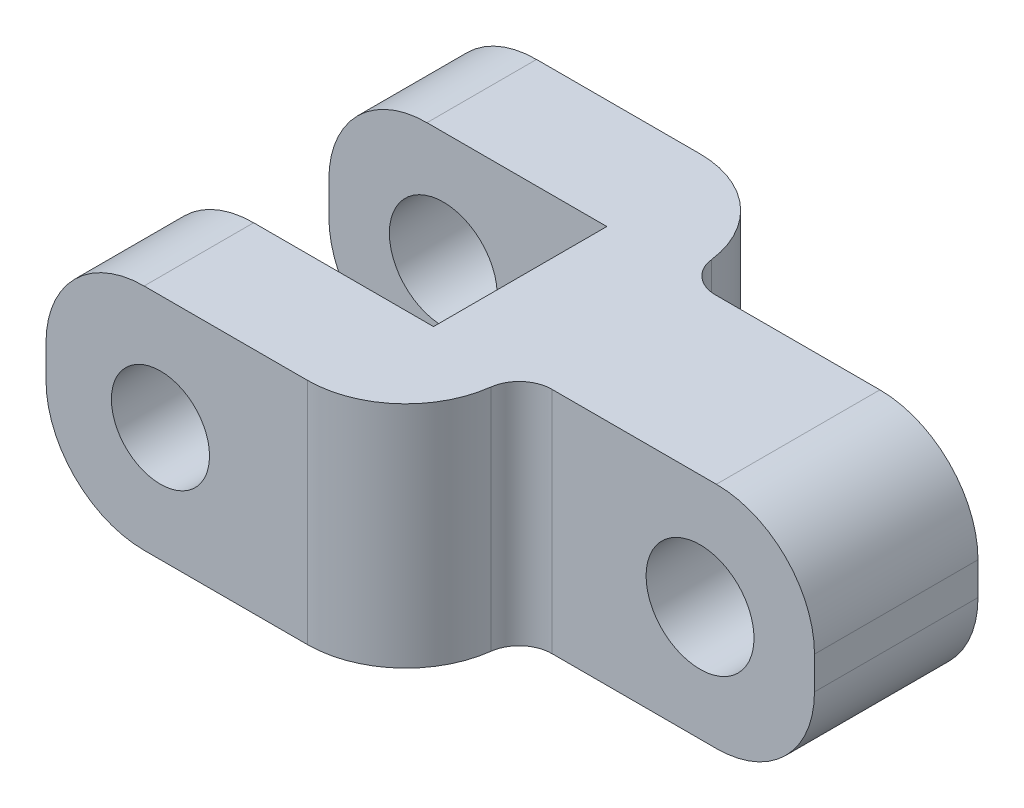
ISO-10303-21;
HEADER;
FILE_DESCRIPTION(('STEP AP214'),'2;1');
FILE_NAME('part.step','',(''),(''),'','','');
FILE_SCHEMA(('AUTOMOTIVE_DESIGN { 1 0 10303 214 1 1 1 1 }'));
ENDSEC;
DATA;
#1=APPLICATION_CONTEXT('core data for automotive mechanical design processes');
#2=APPLICATION_PROTOCOL_DEFINITION('international standard','automotive_design',2000,#1);
#3=PRODUCT_CONTEXT('',#1,'mechanical');
#4=PRODUCT('Part','Part','',(#3));
#5=PRODUCT_RELATED_PRODUCT_CATEGORY('part','',(#4));
#6=PRODUCT_DEFINITION_FORMATION('','',#4);
#7=PRODUCT_DEFINITION_CONTEXT('part definition',#1,'design');
#8=PRODUCT_DEFINITION('design','',#6,#7);
#9=PRODUCT_DEFINITION_SHAPE('','',#8);
#10=(LENGTH_UNIT() NAMED_UNIT(*) SI_UNIT(.MILLI.,.METRE.));
#11=(NAMED_UNIT(*) PLANE_ANGLE_UNIT() SI_UNIT($,.RADIAN.));
#12=(NAMED_UNIT(*) SI_UNIT($,.STERADIAN.) SOLID_ANGLE_UNIT());
#13=UNCERTAINTY_MEASURE_WITH_UNIT(LENGTH_MEASURE(1.E-05),#10,'distance_accuracy_value','');
#14=(GEOMETRIC_REPRESENTATION_CONTEXT(3) GLOBAL_UNCERTAINTY_ASSIGNED_CONTEXT((#13)) GLOBAL_UNIT_ASSIGNED_CONTEXT((#10,
#11,#12)) REPRESENTATION_CONTEXT('',''));
#15=CARTESIAN_POINT('',(0.,0.,0.));
#16=DIRECTION('',(0.,0.,1.));
#17=DIRECTION('',(1.,0.,0.));
#18=AXIS2_PLACEMENT_3D('',#15,#16,#17);
#19=CARTESIAN_POINT('',(-10.,3.5,12.));
#20=DIRECTION('',(1.,0.,0.));
#21=DIRECTION('',(0.,1.,0.));
#22=AXIS2_PLACEMENT_3D('',#19,#20,#21);
#23=PLANE('',#22);
#24=DIRECTION('',(0.,-1.,0.));
#25=VECTOR('',#24,1.);
#26=CARTESIAN_POINT('',(-10.,3.5,0.));
#27=LINE('',#26,#25);
#28=CARTESIAN_POINT('',(-10.,0.500000000000002,0.));
#29=VERTEX_POINT('',#28);
#30=CARTESIAN_POINT('',(-10.,-0.499999999999998,0.));
#31=VERTEX_POINT('',#30);
#32=EDGE_CURVE('E236',#29,#31,#27,.T.);
#33=ORIENTED_EDGE('',*,*,#32,.T.);
#34=DIRECTION('',(0.,0.,-1.));
#35=VECTOR('',#34,1.);
#36=CARTESIAN_POINT('',(-10.,-0.499999999999998,12.));
#37=LINE('',#36,#35);
#38=CARTESIAN_POINT('',(-10.,-0.499999999999999,3.35));
#39=VERTEX_POINT('',#38);
#40=EDGE_CURVE('E301',#31,#39,#37,.F.);
#41=ORIENTED_EDGE('',*,*,#40,.T.);
#42=DIRECTION('',(0.,1.,0.));
#43=VECTOR('',#42,1.);
#44=CARTESIAN_POINT('',(-10.,-8.5,3.35));
#45=LINE('',#44,#43);
#46=CARTESIAN_POINT('',(-10.,0.500000000000002,3.35));
#47=VERTEX_POINT('',#46);
#48=EDGE_CURVE('E211',#39,#47,#45,.T.);
#49=ORIENTED_EDGE('',*,*,#48,.T.);
#50=DIRECTION('',(0.,0.,-1.));
#51=VECTOR('',#50,1.);
#52=CARTESIAN_POINT('',(-10.,0.500000000000002,12.));
#53=LINE('',#52,#51);
#54=EDGE_CURVE('E298',#47,#29,#53,.T.);
#55=ORIENTED_EDGE('',*,*,#54,.T.);
#56=EDGE_LOOP('',(#33,#41,#49,#55));
#57=FACE_BOUND('',#56,.T.);
#58=ADVANCED_FACE('F41',(#57),#23,.F.);
#59=CARTESIAN_POINT('',(-6.5,0.,12.));
#60=DIRECTION('',(0.,0.,-1.));
#61=DIRECTION('',(-1.,0.,0.));
#62=AXIS2_PLACEMENT_3D('',#59,#60,#61);
#63=CYLINDRICAL_SURFACE('',#62,1.65);
#64=CARTESIAN_POINT('',(-6.5,0.,3.35));
#65=DIRECTION('',(0.,0.,-1.));
#66=DIRECTION('',(-1.,0.,0.));
#67=AXIS2_PLACEMENT_3D('',#64,#65,#66);
#68=CIRCLE('',#67,1.65);
#69=CARTESIAN_POINT('',(-8.15,0.,3.35));
#70=VERTEX_POINT('',#69);
#71=EDGE_CURVE('E218',#70,#70,#68,.T.);
#72=ORIENTED_EDGE('',*,*,#71,.F.);
#73=EDGE_LOOP('',(#72));
#74=FACE_BOUND('',#73,.T.);
#75=CARTESIAN_POINT('',(-6.5,0.,0.));
#76=DIRECTION('',(0.,0.,1.));
#77=DIRECTION('',(1.,0.,0.));
#78=AXIS2_PLACEMENT_3D('',#75,#76,#77);
#79=CIRCLE('',#78,1.65);
#80=CARTESIAN_POINT('',(-4.85,0.,0.));
#81=VERTEX_POINT('',#80);
#82=EDGE_CURVE('E222',#81,#81,#79,.T.);
#83=ORIENTED_EDGE('',*,*,#82,.F.);
#84=EDGE_LOOP('',(#83));
#85=FACE_BOUND('',#84,.T.);
#86=ADVANCED_FACE('F402',(#74,#85),#63,.F.);
#87=CARTESIAN_POINT('',(0.,0.,12.));
#88=DIRECTION('',(0.,0.,1.));
#89=DIRECTION('',(1.,0.,0.));
#90=AXIS2_PLACEMENT_3D('',#87,#88,#89);
#91=PLANE('',#90);
#92=DIRECTION('',(1.,0.,0.));
#93=VECTOR('',#92,1.);
#94=CARTESIAN_POINT('',(-10.,-3.5,12.));
#95=LINE('',#94,#93);
#96=CARTESIAN_POINT('',(-7.,-3.5,12.));
#97=VERTEX_POINT('',#96);
#98=CARTESIAN_POINT('',(-2.,-3.5,12.));
#99=VERTEX_POINT('',#98);
#100=EDGE_CURVE('E232',#97,#99,#95,.T.);
#101=ORIENTED_EDGE('',*,*,#100,.T.);
#102=DIRECTION('',(0.,1.,0.));
#103=VECTOR('',#102,1.);
#104=CARTESIAN_POINT('',(-2.,3.5,12.));
#105=LINE('',#104,#103);
#106=CARTESIAN_POINT('',(-2.,3.5,12.));
#107=VERTEX_POINT('',#106);
#108=EDGE_CURVE('E318',#99,#107,#105,.T.);
#109=ORIENTED_EDGE('',*,*,#108,.T.);
#110=DIRECTION('',(-1.,0.,0.));
#111=VECTOR('',#110,1.);
#112=CARTESIAN_POINT('',(-10.,3.5,12.));
#113=LINE('',#112,#111);
#114=CARTESIAN_POINT('',(-7.,3.5,12.));
#115=VERTEX_POINT('',#114);
#116=EDGE_CURVE('E226',#107,#115,#113,.T.);
#117=ORIENTED_EDGE('',*,*,#116,.T.);
#118=CARTESIAN_POINT('',(-7.,0.500000000000001,12.));
#119=DIRECTION('',(0.,0.,1.));
#120=DIRECTION('',(1.,0.,0.));
#121=AXIS2_PLACEMENT_3D('',#118,#119,#120);
#122=CIRCLE('',#121,3.);
#123=CARTESIAN_POINT('',(-10.,0.500000000000002,12.));
#124=VERTEX_POINT('',#123);
#125=EDGE_CURVE('E289',#115,#124,#122,.T.);
#126=ORIENTED_EDGE('',*,*,#125,.T.);
#127=DIRECTION('',(0.,-1.,0.));
#128=VECTOR('',#127,1.);
#129=CARTESIAN_POINT('',(-10.,3.5,12.));
#130=LINE('',#129,#128);
#131=CARTESIAN_POINT('',(-10.,-0.499999999999998,12.));
#132=VERTEX_POINT('',#131);
#133=EDGE_CURVE('E228',#124,#132,#130,.T.);
#134=ORIENTED_EDGE('',*,*,#133,.T.);
#135=CARTESIAN_POINT('',(-7.,-0.499999999999999,12.));
#136=DIRECTION('',(0.,0.,1.));
#137=DIRECTION('',(1.,0.,0.));
#138=AXIS2_PLACEMENT_3D('',#135,#136,#137);
#139=CIRCLE('',#138,3.);
#140=EDGE_CURVE('E291',#132,#97,#139,.T.);
#141=ORIENTED_EDGE('',*,*,#140,.T.);
#142=EDGE_LOOP('',(#101,#109,#117,#126,#134,#141));
#143=FACE_BOUND('',#142,.T.);
#144=CARTESIAN_POINT('',(-6.5,0.,12.));
#145=DIRECTION('',(0.,0.,1.));
#146=DIRECTION('',(1.,0.,0.));
#147=AXIS2_PLACEMENT_3D('',#144,#145,#146);
#148=CIRCLE('',#147,1.5);
#149=CARTESIAN_POINT('',(-5.,0.,12.));
#150=VERTEX_POINT('',#149);
#151=EDGE_CURVE('E574',#150,#150,#148,.F.);
#152=ORIENTED_EDGE('',*,*,#151,.T.);
#153=EDGE_LOOP('',(#152));
#154=FACE_BOUND('',#153,.T.);
#155=ADVANCED_FACE('F383',(#143,#154),#91,.T.);
#156=CARTESIAN_POINT('',(0.,0.,0.));
#157=DIRECTION('',(0.,0.,1.));
#158=DIRECTION('',(1.,0.,0.));
#159=AXIS2_PLACEMENT_3D('',#156,#157,#158);
#160=PLANE('',#159);
#161=DIRECTION('',(-1.,0.,0.));
#162=VECTOR('',#161,1.);
#163=CARTESIAN_POINT('',(-10.,3.5,0.));
#164=LINE('',#163,#162);
#165=CARTESIAN_POINT('',(-2.,3.5,0.));
#166=VERTEX_POINT('',#165);
#167=CARTESIAN_POINT('',(-7.,3.5,0.));
#168=VERTEX_POINT('',#167);
#169=EDGE_CURVE('E225',#166,#168,#164,.T.);
#170=ORIENTED_EDGE('',*,*,#169,.F.);
#171=DIRECTION('',(0.,1.,0.));
#172=VECTOR('',#171,1.);
#173=CARTESIAN_POINT('',(-2.,0.,0.));
#174=LINE('',#173,#172);
#175=CARTESIAN_POINT('',(-2.,-3.5,0.));
#176=VERTEX_POINT('',#175);
#177=EDGE_CURVE('E311',#166,#176,#174,.F.);
#178=ORIENTED_EDGE('',*,*,#177,.T.);
#179=DIRECTION('',(1.,0.,0.));
#180=VECTOR('',#179,1.);
#181=CARTESIAN_POINT('',(-10.,-3.5,0.));
#182=LINE('',#181,#180);
#183=CARTESIAN_POINT('',(-7.,-3.5,0.));
#184=VERTEX_POINT('',#183);
#185=EDGE_CURVE('E229',#184,#176,#182,.T.);
#186=ORIENTED_EDGE('',*,*,#185,.F.);
#187=CARTESIAN_POINT('',(-7.,-0.499999999999999,0.));
#188=DIRECTION('',(0.,0.,1.));
#189=DIRECTION('',(1.,0.,0.));
#190=AXIS2_PLACEMENT_3D('',#187,#188,#189);
#191=CIRCLE('',#190,3.);
#192=EDGE_CURVE('E296',#184,#31,#191,.F.);
#193=ORIENTED_EDGE('',*,*,#192,.T.);
#194=ORIENTED_EDGE('',*,*,#32,.F.);
#195=CARTESIAN_POINT('',(-7.,0.500000000000001,0.));
#196=DIRECTION('',(0.,0.,1.));
#197=DIRECTION('',(1.,0.,0.));
#198=AXIS2_PLACEMENT_3D('',#195,#196,#197);
#199=CIRCLE('',#198,3.);
#200=EDGE_CURVE('E293',#29,#168,#199,.F.);
#201=ORIENTED_EDGE('',*,*,#200,.T.);
#202=EDGE_LOOP('',(#170,#178,#186,#193,#194,#201));
#203=FACE_BOUND('',#202,.T.);
#204=ORIENTED_EDGE('',*,*,#82,.T.);
#205=EDGE_LOOP('',(#204));
#206=FACE_BOUND('',#205,.T.);
#207=ADVANCED_FACE('F354',(#203,#206),#160,.F.);
#208=CARTESIAN_POINT('',(10.,3.5,12.));
#209=DIRECTION('',(-1.,0.,0.));
#210=DIRECTION('',(0.,0.,1.));
#211=AXIS2_PLACEMENT_3D('',#208,#209,#210);
#212=PLANE('',#211);
#213=DIRECTION('',(0.,1.,0.));
#214=VECTOR('',#213,1.);
#215=CARTESIAN_POINT('',(10.,-8.5,8.5));
#216=LINE('',#215,#214);
#217=CARTESIAN_POINT('',(10.,-0.499999999999999,8.5));
#218=VERTEX_POINT('',#217);
#219=CARTESIAN_POINT('',(10.,0.5,8.5));
#220=VERTEX_POINT('',#219);
#221=EDGE_CURVE('E573',#218,#220,#216,.T.);
#222=ORIENTED_EDGE('',*,*,#221,.F.);
#223=DIRECTION('',(0.,0.,-1.));
#224=VECTOR('',#223,1.);
#225=CARTESIAN_POINT('',(10.,-0.499999999999999,12.));
#226=LINE('',#225,#224);
#227=CARTESIAN_POINT('',(10.,-0.499999999999999,3.5));
#228=VERTEX_POINT('',#227);
#229=EDGE_CURVE('E254',#218,#228,#226,.T.);
#230=ORIENTED_EDGE('',*,*,#229,.T.);
#231=DIRECTION('',(0.,1.,0.));
#232=VECTOR('',#231,1.);
#233=CARTESIAN_POINT('',(10.,-8.5,3.5));
#234=LINE('',#233,#232);
#235=CARTESIAN_POINT('',(10.,0.5,3.5));
#236=VERTEX_POINT('',#235);
#237=EDGE_CURVE('E249',#228,#236,#234,.T.);
#238=ORIENTED_EDGE('',*,*,#237,.T.);
#239=DIRECTION('',(0.,0.,-1.));
#240=VECTOR('',#239,1.);
#241=CARTESIAN_POINT('',(10.,0.500000000000001,12.));
#242=LINE('',#241,#240);
#243=EDGE_CURVE('E244',#236,#220,#242,.F.);
#244=ORIENTED_EDGE('',*,*,#243,.T.);
#245=EDGE_LOOP('',(#222,#230,#238,#244));
#246=FACE_BOUND('',#245,.T.);
#247=ADVANCED_FACE('F419',(#246),#212,.F.);
#248=CARTESIAN_POINT('',(-10.,3.5,12.));
#249=DIRECTION('',(0.,-1.,0.));
#250=DIRECTION('',(0.,0.,-1.));
#251=AXIS2_PLACEMENT_3D('',#248,#249,#250);
#252=PLANE('',#251);
#253=DIRECTION('',(1.,0.,0.));
#254=VECTOR('',#253,1.);
#255=CARTESIAN_POINT('',(10.,3.5,3.5));
#256=LINE('',#255,#254);
#257=CARTESIAN_POINT('',(1.96862696659689,3.5,3.5));
#258=VERTEX_POINT('',#257);
#259=CARTESIAN_POINT('',(7.,3.5,3.5));
#260=VERTEX_POINT('',#259);
#261=EDGE_CURVE('E348',#258,#260,#256,.T.);
#262=ORIENTED_EDGE('',*,*,#261,.F.);
#263=CARTESIAN_POINT('',(1.96862696659689,3.5,2.5));
#264=DIRECTION('',(0.,-1.,0.));
#265=DIRECTION('',(0.,0.,-1.));
#266=AXIS2_PLACEMENT_3D('',#263,#264,#265);
#267=CIRCLE('',#266,1.);
#268=CARTESIAN_POINT('',(0.976470224947667,3.5,2.625));
#269=VERTEX_POINT('',#268);
#270=EDGE_CURVE('E330',#258,#269,#267,.T.);
#271=ORIENTED_EDGE('',*,*,#270,.T.);
#272=CARTESIAN_POINT('',(-2.,3.5,3.));
#273=DIRECTION('',(0.,-1.,0.));
#274=DIRECTION('',(0.,0.,-1.));
#275=AXIS2_PLACEMENT_3D('',#272,#273,#274);
#276=CIRCLE('',#275,3.);
#277=EDGE_CURVE('E309',#269,#166,#276,.F.);
#278=ORIENTED_EDGE('',*,*,#277,.T.);
#279=ORIENTED_EDGE('',*,*,#169,.T.);
#280=DIRECTION('',(0.,0.,-1.));
#281=VECTOR('',#280,1.);
#282=CARTESIAN_POINT('',(-7.,3.5,12.));
#283=LINE('',#282,#281);
#284=CARTESIAN_POINT('',(-7.,3.5,3.35));
#285=VERTEX_POINT('',#284);
#286=EDGE_CURVE('E274',#168,#285,#283,.F.);
#287=ORIENTED_EDGE('',*,*,#286,.T.);
#288=DIRECTION('',(-1.,0.,0.));
#289=VECTOR('',#288,1.);
#290=CARTESIAN_POINT('',(-10.,3.5,3.35));
#291=LINE('',#290,#289);
#292=CARTESIAN_POINT('',(-1.5,3.5,3.35));
#293=VERTEX_POINT('',#292);
#294=EDGE_CURVE('E206',#293,#285,#291,.T.);
#295=ORIENTED_EDGE('',*,*,#294,.F.);
#296=DIRECTION('',(0.,0.,-1.));
#297=VECTOR('',#296,1.);
#298=CARTESIAN_POINT('',(-1.5,3.5,3.35));
#299=LINE('',#298,#297);
#300=CARTESIAN_POINT('',(-1.5,3.5,8.65));
#301=VERTEX_POINT('',#300);
#302=EDGE_CURVE('E190',#301,#293,#299,.T.);
#303=ORIENTED_EDGE('',*,*,#302,.F.);
#304=DIRECTION('',(1.,0.,0.));
#305=VECTOR('',#304,1.);
#306=CARTESIAN_POINT('',(-10.,3.5,8.65));
#307=LINE('',#306,#305);
#308=CARTESIAN_POINT('',(-7.,3.5,8.65));
#309=VERTEX_POINT('',#308);
#310=EDGE_CURVE('E178',#309,#301,#307,.T.);
#311=ORIENTED_EDGE('',*,*,#310,.F.);
#312=DIRECTION('',(0.,0.,-1.));
#313=VECTOR('',#312,1.);
#314=CARTESIAN_POINT('',(-7.,3.5,12.));
#315=LINE('',#314,#313);
#316=EDGE_CURVE('E276',#309,#115,#315,.F.);
#317=ORIENTED_EDGE('',*,*,#316,.T.);
#318=ORIENTED_EDGE('',*,*,#116,.F.);
#319=CARTESIAN_POINT('',(-2.,3.5,9.));
#320=DIRECTION('',(0.,-1.,0.));
#321=DIRECTION('',(0.,0.,-1.));
#322=AXIS2_PLACEMENT_3D('',#319,#320,#321);
#323=CIRCLE('',#322,3.);
#324=CARTESIAN_POINT('',(0.976470224947667,3.5,9.375));
#325=VERTEX_POINT('',#324);
#326=EDGE_CURVE('E307',#107,#325,#323,.F.);
#327=ORIENTED_EDGE('',*,*,#326,.T.);
#328=CARTESIAN_POINT('',(1.96862696659689,3.5,9.5));
#329=DIRECTION('',(0.,-1.,0.));
#330=DIRECTION('',(0.,0.,-1.));
#331=AXIS2_PLACEMENT_3D('',#328,#329,#330);
#332=CIRCLE('',#331,1.);
#333=CARTESIAN_POINT('',(1.96862696659689,3.5,8.5));
#334=VERTEX_POINT('',#333);
#335=EDGE_CURVE('E49',#325,#334,#332,.T.);
#336=ORIENTED_EDGE('',*,*,#335,.T.);
#337=DIRECTION('',(-1.,0.,0.));
#338=VECTOR('',#337,1.);
#339=CARTESIAN_POINT('',(10.,3.5,8.5));
#340=LINE('',#339,#338);
#341=CARTESIAN_POINT('',(7.,3.5,8.5));
#342=VERTEX_POINT('',#341);
#343=EDGE_CURVE('E569',#342,#334,#340,.T.);
#344=ORIENTED_EDGE('',*,*,#343,.F.);
#345=DIRECTION('',(0.,0.,-1.));
#346=VECTOR('',#345,1.);
#347=CARTESIAN_POINT('',(7.,3.5,12.));
#348=LINE('',#347,#346);
#349=EDGE_CURVE('E278',#342,#260,#348,.T.);
#350=ORIENTED_EDGE('',*,*,#349,.T.);
#351=EDGE_LOOP('',(#262,#271,#278,#279,#287,#295,#303,#311,#317,#318,#327,#336,#344,#350));
#352=FACE_BOUND('',#351,.T.);
#353=ADVANCED_FACE('F204',(#352),#252,.F.);
#354=DIRECTION('',(0.,1.,0.));
#355=VECTOR('',#354,1.);
#356=CARTESIAN_POINT('',(-10.,-8.5,8.65));
#357=LINE('',#356,#355);
#358=CARTESIAN_POINT('',(-10.,-0.499999999999999,8.65));
#359=VERTEX_POINT('',#358);
#360=CARTESIAN_POINT('',(-10.,0.500000000000002,8.65));
#361=VERTEX_POINT('',#360);
#362=EDGE_CURVE('E201',#359,#361,#357,.T.);
#363=ORIENTED_EDGE('',*,*,#362,.F.);
#364=DIRECTION('',(0.,0.,-1.));
#365=VECTOR('',#364,1.);
#366=CARTESIAN_POINT('',(-10.,-0.499999999999998,12.));
#367=LINE('',#366,#365);
#368=EDGE_CURVE('E287',#359,#132,#367,.F.);
#369=ORIENTED_EDGE('',*,*,#368,.T.);
#370=ORIENTED_EDGE('',*,*,#133,.F.);
#371=DIRECTION('',(0.,0.,-1.));
#372=VECTOR('',#371,1.);
#373=CARTESIAN_POINT('',(-10.,0.500000000000002,12.));
#374=LINE('',#373,#372);
#375=EDGE_CURVE('E284',#124,#361,#374,.T.);
#376=ORIENTED_EDGE('',*,*,#375,.T.);
#377=EDGE_LOOP('',(#363,#369,#370,#376));
#378=FACE_BOUND('',#377,.T.);
#379=ADVANCED_FACE('F377',(#378),#23,.F.);
#380=CARTESIAN_POINT('',(-10.,-3.5,12.));
#381=DIRECTION('',(0.,1.,0.));
#382=DIRECTION('',(0.,0.,1.));
#383=AXIS2_PLACEMENT_3D('',#380,#381,#382);
#384=PLANE('',#383);
#385=ORIENTED_EDGE('',*,*,#185,.T.);
#386=CARTESIAN_POINT('',(-2.,-3.5,3.));
#387=DIRECTION('',(0.,1.,0.));
#388=DIRECTION('',(0.,0.,1.));
#389=AXIS2_PLACEMENT_3D('',#386,#387,#388);
#390=CIRCLE('',#389,3.);
#391=CARTESIAN_POINT('',(0.976470224947667,-3.5,2.625));
#392=VERTEX_POINT('',#391);
#393=EDGE_CURVE('E315',#176,#392,#390,.F.);
#394=ORIENTED_EDGE('',*,*,#393,.T.);
#395=CARTESIAN_POINT('',(1.96862696659689,-3.5,2.5));
#396=DIRECTION('',(0.,1.,0.));
#397=DIRECTION('',(0.,0.,1.));
#398=AXIS2_PLACEMENT_3D('',#395,#396,#397);
#399=CIRCLE('',#398,1.);
#400=CARTESIAN_POINT('',(1.96862696659689,-3.5,3.5));
#401=VERTEX_POINT('',#400);
#402=EDGE_CURVE('E332',#392,#401,#399,.T.);
#403=ORIENTED_EDGE('',*,*,#402,.T.);
#404=DIRECTION('',(1.,0.,0.));
#405=VECTOR('',#404,1.);
#406=CARTESIAN_POINT('',(-10.,-3.5,3.5));
#407=LINE('',#406,#405);
#408=CARTESIAN_POINT('',(7.,-3.5,3.5));
#409=VERTEX_POINT('',#408);
#410=EDGE_CURVE('E191',#401,#409,#407,.T.);
#411=ORIENTED_EDGE('',*,*,#410,.T.);
#412=DIRECTION('',(0.,0.,-1.));
#413=VECTOR('',#412,1.);
#414=CARTESIAN_POINT('',(7.,-3.5,12.));
#415=LINE('',#414,#413);
#416=CARTESIAN_POINT('',(7.,-3.5,8.5));
#417=VERTEX_POINT('',#416);
#418=EDGE_CURVE('E268',#409,#417,#415,.F.);
#419=ORIENTED_EDGE('',*,*,#418,.T.);
#420=DIRECTION('',(-1.,0.,0.));
#421=VECTOR('',#420,1.);
#422=CARTESIAN_POINT('',(-10.,-3.5,8.5));
#423=LINE('',#422,#421);
#424=CARTESIAN_POINT('',(1.96862696659689,-3.5,8.5));
#425=VERTEX_POINT('',#424);
#426=EDGE_CURVE('E248',#417,#425,#423,.T.);
#427=ORIENTED_EDGE('',*,*,#426,.T.);
#428=CARTESIAN_POINT('',(1.96862696659689,-3.5,9.5));
#429=DIRECTION('',(0.,1.,0.));
#430=DIRECTION('',(0.,0.,1.));
#431=AXIS2_PLACEMENT_3D('',#428,#429,#430);
#432=CIRCLE('',#431,1.);
#433=CARTESIAN_POINT('',(0.976470224947667,-3.5,9.375));
#434=VERTEX_POINT('',#433);
#435=EDGE_CURVE('E11',#425,#434,#432,.T.);
#436=ORIENTED_EDGE('',*,*,#435,.T.);
#437=CARTESIAN_POINT('',(-2.,-3.5,9.));
#438=DIRECTION('',(0.,1.,0.));
#439=DIRECTION('',(0.,0.,1.));
#440=AXIS2_PLACEMENT_3D('',#437,#438,#439);
#441=CIRCLE('',#440,3.);
#442=EDGE_CURVE('E313',#434,#99,#441,.F.);
#443=ORIENTED_EDGE('',*,*,#442,.T.);
#444=ORIENTED_EDGE('',*,*,#100,.F.);
#445=DIRECTION('',(0.,0.,-1.));
#446=VECTOR('',#445,1.);
#447=CARTESIAN_POINT('',(-7.,-3.5,12.));
#448=LINE('',#447,#446);
#449=CARTESIAN_POINT('',(-7.,-3.5,8.65));
#450=VERTEX_POINT('',#449);
#451=EDGE_CURVE('E265',#97,#450,#448,.T.);
#452=ORIENTED_EDGE('',*,*,#451,.T.);
#453=DIRECTION('',(1.,0.,0.));
#454=VECTOR('',#453,1.);
#455=CARTESIAN_POINT('',(-10.,-3.5,8.65));
#456=LINE('',#455,#454);
#457=CARTESIAN_POINT('',(-1.5,-3.5,8.65));
#458=VERTEX_POINT('',#457);
#459=EDGE_CURVE('E214',#450,#458,#456,.T.);
#460=ORIENTED_EDGE('',*,*,#459,.T.);
#461=DIRECTION('',(0.,0.,-1.));
#462=VECTOR('',#461,1.);
#463=CARTESIAN_POINT('',(-1.5,-3.5,12.));
#464=LINE('',#463,#462);
#465=CARTESIAN_POINT('',(-1.5,-3.5,3.35));
#466=VERTEX_POINT('',#465);
#467=EDGE_CURVE('E199',#458,#466,#464,.T.);
#468=ORIENTED_EDGE('',*,*,#467,.T.);
#469=DIRECTION('',(-1.,0.,0.));
#470=VECTOR('',#469,1.);
#471=CARTESIAN_POINT('',(-10.,-3.5,3.35));
#472=LINE('',#471,#470);
#473=CARTESIAN_POINT('',(-7.,-3.5,3.35));
#474=VERTEX_POINT('',#473);
#475=EDGE_CURVE('E219',#466,#474,#472,.T.);
#476=ORIENTED_EDGE('',*,*,#475,.T.);
#477=DIRECTION('',(0.,0.,-1.));
#478=VECTOR('',#477,1.);
#479=CARTESIAN_POINT('',(-7.,-3.5,12.));
#480=LINE('',#479,#478);
#481=EDGE_CURVE('E262',#474,#184,#480,.T.);
#482=ORIENTED_EDGE('',*,*,#481,.T.);
#483=EDGE_LOOP('',(#385,#394,#403,#411,#419,#427,#436,#443,#444,#452,#460,#468,#476,#482));
#484=FACE_BOUND('',#483,.T.);
#485=ADVANCED_FACE('F336',(#484),#384,.F.);
#486=CARTESIAN_POINT('',(-1.5,-8.5,3.35));
#487=DIRECTION('',(1.,0.,0.));
#488=DIRECTION('',(0.,0.,-1.));
#489=AXIS2_PLACEMENT_3D('',#486,#487,#488);
#490=PLANE('',#489);
#491=DIRECTION('',(0.,1.,0.));
#492=VECTOR('',#491,1.);
#493=CARTESIAN_POINT('',(-1.5,-8.5,8.65));
#494=LINE('',#493,#492);
#495=EDGE_CURVE('E183',#458,#301,#494,.T.);
#496=ORIENTED_EDGE('',*,*,#495,.T.);
#497=ORIENTED_EDGE('',*,*,#302,.T.);
#498=DIRECTION('',(0.,1.,0.));
#499=VECTOR('',#498,1.);
#500=CARTESIAN_POINT('',(-1.5,-8.5,3.35));
#501=LINE('',#500,#499);
#502=EDGE_CURVE('E200',#466,#293,#501,.T.);
#503=ORIENTED_EDGE('',*,*,#502,.F.);
#504=ORIENTED_EDGE('',*,*,#467,.F.);
#505=EDGE_LOOP('',(#496,#497,#503,#504));
#506=FACE_BOUND('',#505,.T.);
#507=ADVANCED_FACE('F195',(#506),#490,.F.);
#508=CARTESIAN_POINT('',(-10.,-8.5,3.35));
#509=DIRECTION('',(0.,0.,-1.));
#510=DIRECTION('',(-1.,0.,0.));
#511=AXIS2_PLACEMENT_3D('',#508,#509,#510);
#512=PLANE('',#511);
#513=ORIENTED_EDGE('',*,*,#71,.T.);
#514=EDGE_LOOP('',(#513));
#515=FACE_BOUND('',#514,.T.);
#516=ORIENTED_EDGE('',*,*,#48,.F.);
#517=CARTESIAN_POINT('',(-7.,-0.499999999999999,3.35));
#518=DIRECTION('',(0.,0.,-1.));
#519=DIRECTION('',(-1.,0.,0.));
#520=AXIS2_PLACEMENT_3D('',#517,#518,#519);
#521=CIRCLE('',#520,3.);
#522=EDGE_CURVE('E305',#39,#474,#521,.F.);
#523=ORIENTED_EDGE('',*,*,#522,.T.);
#524=ORIENTED_EDGE('',*,*,#475,.F.);
#525=ORIENTED_EDGE('',*,*,#502,.T.);
#526=ORIENTED_EDGE('',*,*,#294,.T.);
#527=CARTESIAN_POINT('',(-7.,0.500000000000001,3.35));
#528=DIRECTION('',(0.,0.,-1.));
#529=DIRECTION('',(-1.,0.,0.));
#530=AXIS2_PLACEMENT_3D('',#527,#528,#529);
#531=CIRCLE('',#530,3.);
#532=EDGE_CURVE('E303',#285,#47,#531,.F.);
#533=ORIENTED_EDGE('',*,*,#532,.T.);
#534=EDGE_LOOP('',(#516,#523,#524,#525,#526,#533));
#535=FACE_BOUND('',#534,.T.);
#536=ADVANCED_FACE('F370',(#515,#535),#512,.F.);
#537=CARTESIAN_POINT('',(-10.,-8.5,8.65));
#538=DIRECTION('',(0.,0.,1.));
#539=DIRECTION('',(1.,0.,0.));
#540=AXIS2_PLACEMENT_3D('',#537,#538,#539);
#541=PLANE('',#540);
#542=ORIENTED_EDGE('',*,*,#459,.F.);
#543=CARTESIAN_POINT('',(-7.,-0.499999999999999,8.65));
#544=DIRECTION('',(0.,0.,1.));
#545=DIRECTION('',(1.,0.,0.));
#546=AXIS2_PLACEMENT_3D('',#543,#544,#545);
#547=CIRCLE('',#546,3.);
#548=EDGE_CURVE('E282',#450,#359,#547,.F.);
#549=ORIENTED_EDGE('',*,*,#548,.T.);
#550=ORIENTED_EDGE('',*,*,#362,.T.);
#551=CARTESIAN_POINT('',(-7.,0.500000000000001,8.65));
#552=DIRECTION('',(0.,0.,1.));
#553=DIRECTION('',(1.,0.,0.));
#554=AXIS2_PLACEMENT_3D('',#551,#552,#553);
#555=CIRCLE('',#554,3.);
#556=EDGE_CURVE('E186',#361,#309,#555,.F.);
#557=ORIENTED_EDGE('',*,*,#556,.T.);
#558=ORIENTED_EDGE('',*,*,#310,.T.);
#559=ORIENTED_EDGE('',*,*,#495,.F.);
#560=EDGE_LOOP('',(#542,#549,#550,#557,#558,#559));
#561=FACE_BOUND('',#560,.T.);
#562=CARTESIAN_POINT('',(-6.5,0.,8.65));
#563=DIRECTION('',(0.,0.,-1.));
#564=DIRECTION('',(-1.,0.,0.));
#565=AXIS2_PLACEMENT_3D('',#562,#563,#564);
#566=CIRCLE('',#565,1.5);
#567=CARTESIAN_POINT('',(-8.,0.,8.65));
#568=VERTEX_POINT('',#567);
#569=EDGE_CURVE('E578',#568,#568,#566,.T.);
#570=ORIENTED_EDGE('',*,*,#569,.F.);
#571=EDGE_LOOP('',(#570));
#572=FACE_BOUND('',#571,.T.);
#573=ADVANCED_FACE('F181',(#561,#572),#541,.F.);
#574=CARTESIAN_POINT('',(10.,-8.5,8.5));
#575=DIRECTION('',(0.,0.,-1.));
#576=DIRECTION('',(-1.,0.,0.));
#577=AXIS2_PLACEMENT_3D('',#574,#575,#576);
#578=PLANE('',#577);
#579=CARTESIAN_POINT('',(6.5,0.,8.5));
#580=DIRECTION('',(0.,0.,-1.));
#581=DIRECTION('',(-1.,0.,0.));
#582=AXIS2_PLACEMENT_3D('',#579,#580,#581);
#583=CIRCLE('',#582,1.65);
#584=CARTESIAN_POINT('',(4.85,0.,8.5));
#585=VERTEX_POINT('',#584);
#586=EDGE_CURVE('E245',#585,#585,#583,.T.);
#587=ORIENTED_EDGE('',*,*,#586,.T.);
#588=EDGE_LOOP('',(#587));
#589=FACE_BOUND('',#588,.T.);
#590=ORIENTED_EDGE('',*,*,#343,.T.);
#591=DIRECTION('',(0.,-1.,0.));
#592=VECTOR('',#591,1.);
#593=CARTESIAN_POINT('',(1.96862696659689,-8.5,8.5));
#594=LINE('',#593,#592);
#595=EDGE_CURVE('E62',#334,#425,#594,.T.);
#596=ORIENTED_EDGE('',*,*,#595,.T.);
#597=ORIENTED_EDGE('',*,*,#426,.F.);
#598=CARTESIAN_POINT('',(7.,-0.499999999999999,8.5));
#599=DIRECTION('',(0.,0.,-1.));
#600=DIRECTION('',(-1.,0.,0.));
#601=AXIS2_PLACEMENT_3D('',#598,#599,#600);
#602=CIRCLE('',#601,3.);
#603=EDGE_CURVE('E272',#417,#218,#602,.F.);
#604=ORIENTED_EDGE('',*,*,#603,.T.);
#605=ORIENTED_EDGE('',*,*,#221,.T.);
#606=CARTESIAN_POINT('',(7.,0.500000000000001,8.5));
#607=DIRECTION('',(0.,0.,-1.));
#608=DIRECTION('',(-1.,0.,0.));
#609=AXIS2_PLACEMENT_3D('',#606,#607,#608);
#610=CIRCLE('',#609,3.);
#611=EDGE_CURVE('E270',#220,#342,#610,.F.);
#612=ORIENTED_EDGE('',*,*,#611,.T.);
#613=EDGE_LOOP('',(#590,#596,#597,#604,#605,#612));
#614=FACE_BOUND('',#613,.T.);
#615=ADVANCED_FACE('F476',(#589,#614),#578,.F.);
#616=CARTESIAN_POINT('',(10.,-8.5,3.5));
#617=DIRECTION('',(0.,0.,1.));
#618=DIRECTION('',(1.,0.,0.));
#619=AXIS2_PLACEMENT_3D('',#616,#617,#618);
#620=PLANE('',#619);
#621=CARTESIAN_POINT('',(6.5,0.,3.5));
#622=DIRECTION('',(0.,0.,1.));
#623=DIRECTION('',(1.,0.,0.));
#624=AXIS2_PLACEMENT_3D('',#621,#622,#623);
#625=CIRCLE('',#624,1.65);
#626=CARTESIAN_POINT('',(8.15,0.,3.5));
#627=VERTEX_POINT('',#626);
#628=EDGE_CURVE('E250',#627,#627,#625,.T.);
#629=ORIENTED_EDGE('',*,*,#628,.T.);
#630=EDGE_LOOP('',(#629));
#631=FACE_BOUND('',#630,.T.);
#632=ORIENTED_EDGE('',*,*,#410,.F.);
#633=DIRECTION('',(0.,1.,0.));
#634=VECTOR('',#633,1.);
#635=CARTESIAN_POINT('',(1.96862696659689,-8.5,3.5));
#636=LINE('',#635,#634);
#637=EDGE_CURVE('E321',#401,#258,#636,.T.);
#638=ORIENTED_EDGE('',*,*,#637,.T.);
#639=ORIENTED_EDGE('',*,*,#261,.T.);
#640=CARTESIAN_POINT('',(7.,0.500000000000001,3.5));
#641=DIRECTION('',(0.,0.,1.));
#642=DIRECTION('',(1.,0.,0.));
#643=AXIS2_PLACEMENT_3D('',#640,#641,#642);
#644=CIRCLE('',#643,3.);
#645=EDGE_CURVE('E257',#260,#236,#644,.F.);
#646=ORIENTED_EDGE('',*,*,#645,.T.);
#647=ORIENTED_EDGE('',*,*,#237,.F.);
#648=CARTESIAN_POINT('',(7.,-0.499999999999999,3.5));
#649=DIRECTION('',(0.,0.,1.));
#650=DIRECTION('',(1.,0.,0.));
#651=AXIS2_PLACEMENT_3D('',#648,#649,#650);
#652=CIRCLE('',#651,3.);
#653=EDGE_CURVE('E259',#228,#409,#652,.F.);
#654=ORIENTED_EDGE('',*,*,#653,.T.);
#655=EDGE_LOOP('',(#632,#638,#639,#646,#647,#654));
#656=FACE_BOUND('',#655,.T.);
#657=ADVANCED_FACE('F342',(#631,#656),#620,.F.);
#658=CARTESIAN_POINT('',(6.5,0.,12.));
#659=DIRECTION('',(0.,0.,-1.));
#660=DIRECTION('',(-1.,0.,0.));
#661=AXIS2_PLACEMENT_3D('',#658,#659,#660);
#662=CYLINDRICAL_SURFACE('',#661,1.65);
#663=ORIENTED_EDGE('',*,*,#628,.F.);
#664=EDGE_LOOP('',(#663));
#665=FACE_BOUND('',#664,.T.);
#666=ORIENTED_EDGE('',*,*,#586,.F.);
#667=EDGE_LOOP('',(#666));
#668=FACE_BOUND('',#667,.T.);
#669=ADVANCED_FACE('F430',(#665,#668),#662,.F.);
#670=CARTESIAN_POINT('',(7.,-0.499999999999999,12.));
#671=DIRECTION('',(0.,0.,-1.));
#672=DIRECTION('',(-1.,0.,0.));
#673=AXIS2_PLACEMENT_3D('',#670,#671,#672);
#674=CYLINDRICAL_SURFACE('',#673,3.);
#675=ORIENTED_EDGE('',*,*,#603,.F.);
#676=ORIENTED_EDGE('',*,*,#418,.F.);
#677=ORIENTED_EDGE('',*,*,#653,.F.);
#678=ORIENTED_EDGE('',*,*,#229,.F.);
#679=EDGE_LOOP('',(#675,#676,#677,#678));
#680=FACE_BOUND('',#679,.T.);
#681=ADVANCED_FACE('F426',(#680),#674,.T.);
#682=CARTESIAN_POINT('',(7.,0.500000000000001,12.));
#683=DIRECTION('',(0.,0.,-1.));
#684=DIRECTION('',(-1.,0.,0.));
#685=AXIS2_PLACEMENT_3D('',#682,#683,#684);
#686=CYLINDRICAL_SURFACE('',#685,3.);
#687=ORIENTED_EDGE('',*,*,#611,.F.);
#688=ORIENTED_EDGE('',*,*,#243,.F.);
#689=ORIENTED_EDGE('',*,*,#645,.F.);
#690=ORIENTED_EDGE('',*,*,#349,.F.);
#691=EDGE_LOOP('',(#687,#688,#689,#690));
#692=FACE_BOUND('',#691,.T.);
#693=ADVANCED_FACE('F429',(#692),#686,.T.);
#694=CARTESIAN_POINT('',(-7.,-0.499999999999999,12.));
#695=DIRECTION('',(0.,0.,-1.));
#696=DIRECTION('',(-1.,0.,0.));
#697=AXIS2_PLACEMENT_3D('',#694,#695,#696);
#698=CYLINDRICAL_SURFACE('',#697,3.);
#699=ORIENTED_EDGE('',*,*,#140,.F.);
#700=ORIENTED_EDGE('',*,*,#368,.F.);
#701=ORIENTED_EDGE('',*,*,#548,.F.);
#702=ORIENTED_EDGE('',*,*,#451,.F.);
#703=EDGE_LOOP('',(#699,#700,#701,#702));
#704=FACE_BOUND('',#703,.T.);
#705=ADVANCED_FACE('F381',(#704),#698,.T.);
#706=CARTESIAN_POINT('',(-7.,-0.499999999999999,12.));
#707=DIRECTION('',(0.,0.,-1.));
#708=DIRECTION('',(-1.,0.,0.));
#709=AXIS2_PLACEMENT_3D('',#706,#707,#708);
#710=CYLINDRICAL_SURFACE('',#709,3.);
#711=ORIENTED_EDGE('',*,*,#522,.F.);
#712=ORIENTED_EDGE('',*,*,#40,.F.);
#713=ORIENTED_EDGE('',*,*,#192,.F.);
#714=ORIENTED_EDGE('',*,*,#481,.F.);
#715=EDGE_LOOP('',(#711,#712,#713,#714));
#716=FACE_BOUND('',#715,.T.);
#717=ADVANCED_FACE('F359',(#716),#710,.T.);
#718=CARTESIAN_POINT('',(-7.,0.500000000000001,12.));
#719=DIRECTION('',(0.,0.,-1.));
#720=DIRECTION('',(-1.,0.,0.));
#721=AXIS2_PLACEMENT_3D('',#718,#719,#720);
#722=CYLINDRICAL_SURFACE('',#721,3.);
#723=ORIENTED_EDGE('',*,*,#125,.F.);
#724=ORIENTED_EDGE('',*,*,#316,.F.);
#725=ORIENTED_EDGE('',*,*,#556,.F.);
#726=ORIENTED_EDGE('',*,*,#375,.F.);
#727=EDGE_LOOP('',(#723,#724,#725,#726));
#728=FACE_BOUND('',#727,.T.);
#729=ADVANCED_FACE('F439',(#728),#722,.T.);
#730=CARTESIAN_POINT('',(-7.,0.500000000000001,12.));
#731=DIRECTION('',(0.,0.,-1.));
#732=DIRECTION('',(-1.,0.,0.));
#733=AXIS2_PLACEMENT_3D('',#730,#731,#732);
#734=CYLINDRICAL_SURFACE('',#733,3.);
#735=ORIENTED_EDGE('',*,*,#532,.F.);
#736=ORIENTED_EDGE('',*,*,#286,.F.);
#737=ORIENTED_EDGE('',*,*,#200,.F.);
#738=ORIENTED_EDGE('',*,*,#54,.F.);
#739=EDGE_LOOP('',(#735,#736,#737,#738));
#740=FACE_BOUND('',#739,.T.);
#741=ADVANCED_FACE('F367',(#740),#734,.T.);
#742=CARTESIAN_POINT('',(-2.,-8.5,3.));
#743=DIRECTION('',(0.,1.,0.));
#744=DIRECTION('',(0.,0.,1.));
#745=AXIS2_PLACEMENT_3D('',#742,#743,#744);
#746=CYLINDRICAL_SURFACE('',#745,3.);
#747=ORIENTED_EDGE('',*,*,#277,.F.);
#748=DIRECTION('',(0.,1.,0.));
#749=VECTOR('',#748,1.);
#750=CARTESIAN_POINT('',(0.976470224947668,-8.5,2.625));
#751=LINE('',#750,#749);
#752=EDGE_CURVE('E324',#269,#392,#751,.F.);
#753=ORIENTED_EDGE('',*,*,#752,.T.);
#754=ORIENTED_EDGE('',*,*,#393,.F.);
#755=ORIENTED_EDGE('',*,*,#177,.F.);
#756=EDGE_LOOP('',(#747,#753,#754,#755));
#757=FACE_BOUND('',#756,.T.);
#758=ADVANCED_FACE('F351',(#757),#746,.T.);
#759=CARTESIAN_POINT('',(-2.,0.,9.));
#760=DIRECTION('',(0.,-1.,0.));
#761=DIRECTION('',(0.,0.,-1.));
#762=AXIS2_PLACEMENT_3D('',#759,#760,#761);
#763=CYLINDRICAL_SURFACE('',#762,3.);
#764=ORIENTED_EDGE('',*,*,#442,.F.);
#765=DIRECTION('',(0.,-1.,0.));
#766=VECTOR('',#765,1.);
#767=CARTESIAN_POINT('',(0.976470224947667,0.,9.375));
#768=LINE('',#767,#766);
#769=EDGE_CURVE('E326',#434,#325,#768,.F.);
#770=ORIENTED_EDGE('',*,*,#769,.T.);
#771=ORIENTED_EDGE('',*,*,#326,.F.);
#772=ORIENTED_EDGE('',*,*,#108,.F.);
#773=EDGE_LOOP('',(#764,#770,#771,#772));
#774=FACE_BOUND('',#773,.T.);
#775=ADVANCED_FACE('F390',(#774),#763,.T.);
#776=CARTESIAN_POINT('',(1.96862696659689,-8.5,2.5));
#777=DIRECTION('',(0.,1.,0.));
#778=DIRECTION('',(0.,0.,1.));
#779=AXIS2_PLACEMENT_3D('',#776,#777,#778);
#780=CYLINDRICAL_SURFACE('',#779,1.);
#781=ORIENTED_EDGE('',*,*,#402,.F.);
#782=ORIENTED_EDGE('',*,*,#752,.F.);
#783=ORIENTED_EDGE('',*,*,#270,.F.);
#784=ORIENTED_EDGE('',*,*,#637,.F.);
#785=EDGE_LOOP('',(#781,#782,#783,#784));
#786=FACE_BOUND('',#785,.T.);
#787=ADVANCED_FACE('F345',(#786),#780,.F.);
#788=CARTESIAN_POINT('',(1.96862696659689,0.,9.5));
#789=DIRECTION('',(0.,-1.,0.));
#790=DIRECTION('',(0.,0.,-1.));
#791=AXIS2_PLACEMENT_3D('',#788,#789,#790);
#792=CYLINDRICAL_SURFACE('',#791,1.);
#793=ORIENTED_EDGE('',*,*,#435,.F.);
#794=ORIENTED_EDGE('',*,*,#595,.F.);
#795=ORIENTED_EDGE('',*,*,#335,.F.);
#796=ORIENTED_EDGE('',*,*,#769,.F.);
#797=EDGE_LOOP('',(#793,#794,#795,#796));
#798=FACE_BOUND('',#797,.T.);
#799=ADVANCED_FACE('F43',(#798),#792,.F.);
#800=CARTESIAN_POINT('',(-6.5,0.,16.6669047558312));
#801=DIRECTION('',(0.,0.,-1.));
#802=DIRECTION('',(-1.,0.,0.));
#803=AXIS2_PLACEMENT_3D('',#800,#801,#802);
#804=CYLINDRICAL_SURFACE('',#803,1.5);
#805=ORIENTED_EDGE('',*,*,#569,.T.);
#806=EDGE_LOOP('',(#805));
#807=FACE_BOUND('',#806,.T.);
#808=ORIENTED_EDGE('',*,*,#151,.F.);
#809=EDGE_LOOP('',(#808));
#810=FACE_BOUND('',#809,.T.);
#811=ADVANCED_FACE('F393',(#807,#810),#804,.F.);
#812=CLOSED_SHELL('',(#58,#86,#155,#207,#247,#353,#379,#485,#507,#536,#573,#615,#657,#669,#681,
#693,#705,#717,#729,#741,#758,#775,#787,#799,#811));
#813=MANIFOLD_SOLID_BREP('B2',#812);
#814=ADVANCED_BREP_SHAPE_REPRESENTATION('',(#18,#813),#14);
#815=SHAPE_DEFINITION_REPRESENTATION(#9,#814);
ENDSEC;
END-ISO-10303-21;
